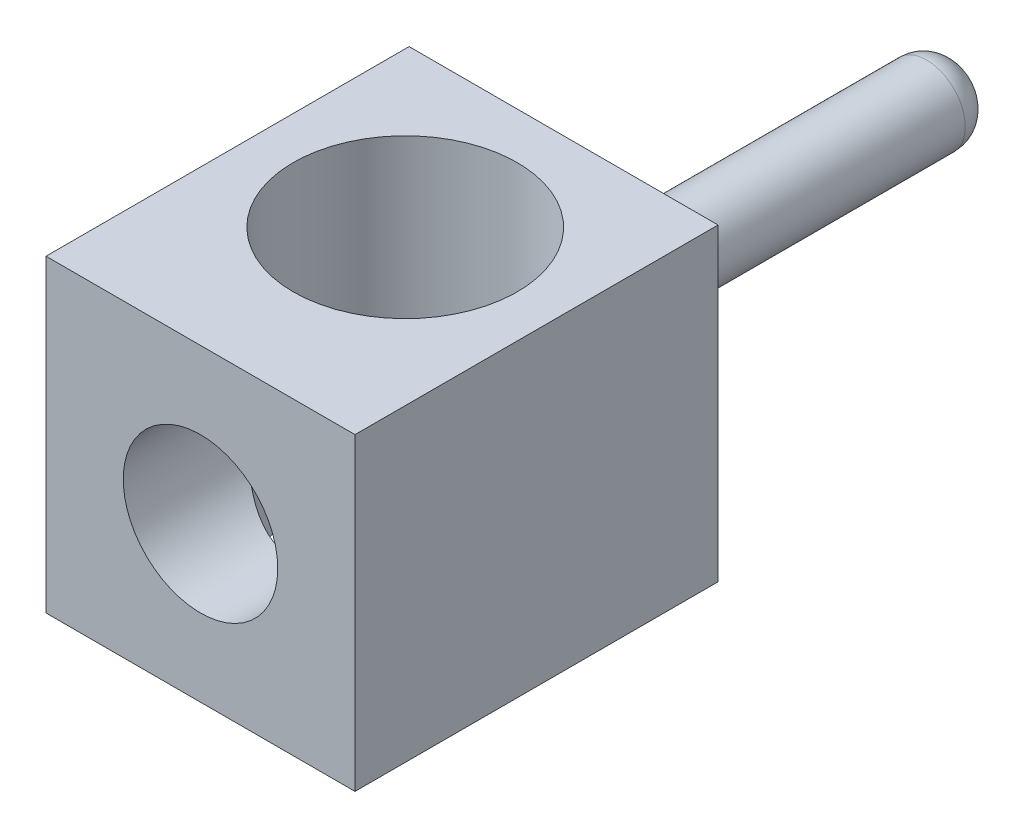
ISO-10303-21;
HEADER;
FILE_DESCRIPTION(('STEP AP214'),'2;1');
FILE_NAME('part.step','',(''),(''),'','','');
FILE_SCHEMA(('AUTOMOTIVE_DESIGN { 1 0 10303 214 1 1 1 1 }'));
ENDSEC;
DATA;
#1=APPLICATION_CONTEXT('core data for automotive mechanical design processes');
#2=APPLICATION_PROTOCOL_DEFINITION('international standard','automotive_design',2000,#1);
#3=PRODUCT_CONTEXT('',#1,'mechanical');
#4=PRODUCT('Part','Part','',(#3));
#5=PRODUCT_RELATED_PRODUCT_CATEGORY('part','',(#4));
#6=PRODUCT_DEFINITION_FORMATION('','',#4);
#7=PRODUCT_DEFINITION_CONTEXT('part definition',#1,'design');
#8=PRODUCT_DEFINITION('design','',#6,#7);
#9=PRODUCT_DEFINITION_SHAPE('','',#8);
#10=(LENGTH_UNIT() NAMED_UNIT(*) SI_UNIT(.MILLI.,.METRE.));
#11=(NAMED_UNIT(*) PLANE_ANGLE_UNIT() SI_UNIT($,.RADIAN.));
#12=(NAMED_UNIT(*) SI_UNIT($,.STERADIAN.) SOLID_ANGLE_UNIT());
#13=UNCERTAINTY_MEASURE_WITH_UNIT(LENGTH_MEASURE(1.E-05),#10,'distance_accuracy_value','');
#14=(GEOMETRIC_REPRESENTATION_CONTEXT(3) GLOBAL_UNCERTAINTY_ASSIGNED_CONTEXT((#13)) GLOBAL_UNIT_ASSIGNED_CONTEXT((#10,
#11,#12)) REPRESENTATION_CONTEXT('',''));
#15=CARTESIAN_POINT('',(0.,0.,0.));
#16=DIRECTION('',(0.,0.,1.));
#17=DIRECTION('',(1.,0.,0.));
#18=AXIS2_PLACEMENT_3D('',#15,#16,#17);
#19=CARTESIAN_POINT('',(0.,0.,-5.1));
#20=DIRECTION('',(0.,0.,-1.));
#21=DIRECTION('',(-1.,0.,0.));
#22=AXIS2_PLACEMENT_3D('',#19,#20,#21);
#23=PLANE('',#22);
#24=CARTESIAN_POINT('',(0.,0.,-5.1));
#25=DIRECTION('',(0.,0.,1.));
#26=DIRECTION('',(-1.,0.,0.));
#27=AXIS2_PLACEMENT_3D('',#24,#25,#26);
#28=CIRCLE('',#27,0.1);
#29=CARTESIAN_POINT('',(-0.1,0.,-5.1));
#30=VERTEX_POINT('',#29);
#31=EDGE_CURVE('E91',#30,#30,#28,.T.);
#32=ORIENTED_EDGE('',*,*,#31,.F.);
#33=EDGE_LOOP('',(#32));
#34=FACE_BOUND('',#33,.T.);
#35=ADVANCED_FACE('F17',(#34),#23,.T.);
#36=CARTESIAN_POINT('',(-0.5,0.,-4.7));
#37=CARTESIAN_POINT('',(-0.5,0.,-4.80471975512));
#38=CARTESIAN_POINT('',(-0.467108925592,0.,-4.909430600282));
#39=CARTESIAN_POINT('',(-0.401276059856,0.,-5.001276059856));
#40=CARTESIAN_POINT('',(-0.309430600282,0.,-5.067108925592));
#41=CARTESIAN_POINT('',(-0.20471975512,0.,-5.1));
#42=CARTESIAN_POINT('',(-0.1,0.,-5.1));
#43=(BOUNDED_CURVE() B_SPLINE_CURVE(6,(#36,#37,#38,#39,#40,#41,#42),.UNSPECIFIED.,.F.,
.F.) B_SPLINE_CURVE_WITH_KNOTS((7,7),(0.,1.570796326795),
.UNSPECIFIED.) CURVE() GEOMETRIC_REPRESENTATION_ITEM() RATIONAL_B_SPLINE_CURVE((1.,1.,1.,1.,1.,
1.,1.)) REPRESENTATION_ITEM(''));
#44=CARTESIAN_POINT('',(0.,0.,-4.7));
#45=DIRECTION('',(0.,0.,1.));
#46=AXIS1_PLACEMENT('',#44,#45);
#47=SURFACE_OF_REVOLUTION('',#43,#46);
#48=CARTESIAN_POINT('',(0.,0.,-4.7));
#49=DIRECTION('',(0.,0.,-1.));
#50=DIRECTION('',(-1.,0.,0.));
#51=AXIS2_PLACEMENT_3D('',#48,#49,#50);
#52=CIRCLE('',#51,0.5);
#53=CARTESIAN_POINT('',(-0.5,0.,-4.7));
#54=VERTEX_POINT('',#53);
#55=EDGE_CURVE('E88',#54,#54,#52,.F.);
#56=ORIENTED_EDGE('',*,*,#55,.F.);
#57=EDGE_LOOP('',(#56));
#58=FACE_BOUND('',#57,.T.);
#59=ORIENTED_EDGE('',*,*,#31,.T.);
#60=EDGE_LOOP('',(#59));
#61=FACE_BOUND('',#60,.T.);
#62=ADVANCED_FACE('F101',(#58,#61),#47,.F.);
#63=CARTESIAN_POINT('',(0.,0.,0.));
#64=DIRECTION('',(0.,0.,-1.));
#65=DIRECTION('',(-1.,0.,0.));
#66=AXIS2_PLACEMENT_3D('',#63,#64,#65);
#67=CYLINDRICAL_SURFACE('',#66,0.5);
#68=ORIENTED_EDGE('',*,*,#55,.T.);
#69=EDGE_LOOP('',(#68));
#70=FACE_BOUND('',#69,.T.);
#71=CARTESIAN_POINT('',(0.,0.,0.));
#72=DIRECTION('',(0.,0.,-1.));
#73=DIRECTION('',(-1.,0.,0.));
#74=AXIS2_PLACEMENT_3D('',#71,#72,#73);
#75=CIRCLE('',#74,0.5);
#76=CARTESIAN_POINT('',(-0.5,0.,0.));
#77=VERTEX_POINT('',#76);
#78=EDGE_CURVE('E21',#77,#77,#75,.F.);
#79=ORIENTED_EDGE('',*,*,#78,.F.);
#80=EDGE_LOOP('',(#79));
#81=FACE_BOUND('',#80,.T.);
#82=ADVANCED_FACE('F105',(#70,#81),#67,.T.);
#83=CARTESIAN_POINT('',(2.,-2.,0.));
#84=DIRECTION('',(0.,0.,-1.));
#85=DIRECTION('',(-1.,0.,0.));
#86=AXIS2_PLACEMENT_3D('',#83,#84,#85);
#87=PLANE('',#86);
#88=ORIENTED_EDGE('',*,*,#78,.T.);
#89=EDGE_LOOP('',(#88));
#90=FACE_BOUND('',#89,.T.);
#91=DIRECTION('',(1.,0.,0.));
#92=VECTOR('',#91,1.);
#93=CARTESIAN_POINT('',(0.,2.,0.));
#94=LINE('',#93,#92);
#95=CARTESIAN_POINT('',(2.,2.,0.));
#96=VERTEX_POINT('',#95);
#97=CARTESIAN_POINT('',(-2.,2.,0.));
#98=VERTEX_POINT('',#97);
#99=EDGE_CURVE('E59',#96,#98,#94,.F.);
#100=ORIENTED_EDGE('',*,*,#99,.F.);
#101=DIRECTION('',(0.,1.,0.));
#102=VECTOR('',#101,1.);
#103=CARTESIAN_POINT('',(2.,-2.,0.));
#104=LINE('',#103,#102);
#105=CARTESIAN_POINT('',(2.,-2.,0.));
#106=VERTEX_POINT('',#105);
#107=EDGE_CURVE('E54',#106,#96,#104,.T.);
#108=ORIENTED_EDGE('',*,*,#107,.F.);
#109=DIRECTION('',(1.,0.,0.));
#110=VECTOR('',#109,1.);
#111=CARTESIAN_POINT('',(0.,-2.,0.));
#112=LINE('',#111,#110);
#113=CARTESIAN_POINT('',(-2.,-2.,0.));
#114=VERTEX_POINT('',#113);
#115=EDGE_CURVE('E73',#106,#114,#112,.F.);
#116=ORIENTED_EDGE('',*,*,#115,.T.);
#117=DIRECTION('',(0.,1.,0.));
#118=VECTOR('',#117,1.);
#119=CARTESIAN_POINT('',(-2.,-2.,0.));
#120=LINE('',#119,#118);
#121=EDGE_CURVE('E71',#98,#114,#120,.F.);
#122=ORIENTED_EDGE('',*,*,#121,.F.);
#123=EDGE_LOOP('',(#100,#108,#116,#122));
#124=FACE_BOUND('',#123,.T.);
#125=ADVANCED_FACE('F72',(#90,#124),#87,.T.);
#126=CARTESIAN_POINT('',(-2.,-2.,0.));
#127=DIRECTION('',(-1.,0.,0.));
#128=DIRECTION('',(0.,0.,1.));
#129=AXIS2_PLACEMENT_3D('',#126,#127,#128);
#130=PLANE('',#129);
#131=DIRECTION('',(0.,0.,1.));
#132=VECTOR('',#131,1.);
#133=CARTESIAN_POINT('',(-2.,2.,0.));
#134=LINE('',#133,#132);
#135=CARTESIAN_POINT('',(-2.,2.,4.7));
#136=VERTEX_POINT('',#135);
#137=EDGE_CURVE('E64',#98,#136,#134,.T.);
#138=ORIENTED_EDGE('',*,*,#137,.F.);
#139=ORIENTED_EDGE('',*,*,#121,.T.);
#140=DIRECTION('',(0.,0.,1.));
#141=VECTOR('',#140,1.);
#142=CARTESIAN_POINT('',(-2.,-2.,0.));
#143=LINE('',#142,#141);
#144=CARTESIAN_POINT('',(-2.,-2.,4.7));
#145=VERTEX_POINT('',#144);
#146=EDGE_CURVE('E154',#114,#145,#143,.T.);
#147=ORIENTED_EDGE('',*,*,#146,.T.);
#148=DIRECTION('',(0.,1.,0.));
#149=VECTOR('',#148,1.);
#150=CARTESIAN_POINT('',(-2.,-2.,4.7));
#151=LINE('',#150,#149);
#152=EDGE_CURVE('E68',#136,#145,#151,.F.);
#153=ORIENTED_EDGE('',*,*,#152,.F.);
#154=EDGE_LOOP('',(#138,#139,#147,#153));
#155=FACE_BOUND('',#154,.T.);
#156=ADVANCED_FACE('F78',(#155),#130,.T.);
#157=CARTESIAN_POINT('',(2.,-2.,4.7));
#158=DIRECTION('',(1.,0.,0.));
#159=DIRECTION('',(0.,0.,-1.));
#160=AXIS2_PLACEMENT_3D('',#157,#158,#159);
#161=PLANE('',#160);
#162=DIRECTION('',(0.,0.,1.));
#163=VECTOR('',#162,1.);
#164=CARTESIAN_POINT('',(2.,2.,0.));
#165=LINE('',#164,#163);
#166=CARTESIAN_POINT('',(2.,2.,4.7));
#167=VERTEX_POINT('',#166);
#168=EDGE_CURVE('E66',#167,#96,#165,.F.);
#169=ORIENTED_EDGE('',*,*,#168,.F.);
#170=DIRECTION('',(0.,1.,0.));
#171=VECTOR('',#170,1.);
#172=CARTESIAN_POINT('',(2.,-2.,4.7));
#173=LINE('',#172,#171);
#174=CARTESIAN_POINT('',(2.,-2.,4.7));
#175=VERTEX_POINT('',#174);
#176=EDGE_CURVE('E36',#175,#167,#173,.T.);
#177=ORIENTED_EDGE('',*,*,#176,.F.);
#178=DIRECTION('',(0.,0.,1.));
#179=VECTOR('',#178,1.);
#180=CARTESIAN_POINT('',(2.,-2.,0.));
#181=LINE('',#180,#179);
#182=EDGE_CURVE('E148',#175,#106,#181,.F.);
#183=ORIENTED_EDGE('',*,*,#182,.T.);
#184=ORIENTED_EDGE('',*,*,#107,.T.);
#185=EDGE_LOOP('',(#169,#177,#183,#184));
#186=FACE_BOUND('',#185,.T.);
#187=ADVANCED_FACE('F162',(#186),#161,.T.);
#188=CARTESIAN_POINT('',(-2.,-2.,4.7));
#189=DIRECTION('',(0.,0.,1.));
#190=DIRECTION('',(1.,0.,0.));
#191=AXIS2_PLACEMENT_3D('',#188,#189,#190);
#192=PLANE('',#191);
#193=CARTESIAN_POINT('',(0.,0.,4.7));
#194=DIRECTION('',(0.,0.,1.));
#195=DIRECTION('',(1.,0.,0.));
#196=AXIS2_PLACEMENT_3D('',#193,#194,#195);
#197=CIRCLE('',#196,1.);
#198=CARTESIAN_POINT('',(1.,0.,4.7));
#199=VERTEX_POINT('',#198);
#200=EDGE_CURVE('E146',#199,#199,#197,.F.);
#201=ORIENTED_EDGE('',*,*,#200,.T.);
#202=EDGE_LOOP('',(#201));
#203=FACE_BOUND('',#202,.T.);
#204=DIRECTION('',(1.,0.,0.));
#205=VECTOR('',#204,1.);
#206=CARTESIAN_POINT('',(0.,2.,4.7));
#207=LINE('',#206,#205);
#208=EDGE_CURVE('E80',#136,#167,#207,.T.);
#209=ORIENTED_EDGE('',*,*,#208,.F.);
#210=ORIENTED_EDGE('',*,*,#152,.T.);
#211=DIRECTION('',(1.,0.,0.));
#212=VECTOR('',#211,1.);
#213=CARTESIAN_POINT('',(0.,-2.,4.7));
#214=LINE('',#213,#212);
#215=EDGE_CURVE('E151',#145,#175,#214,.T.);
#216=ORIENTED_EDGE('',*,*,#215,.T.);
#217=ORIENTED_EDGE('',*,*,#176,.T.);
#218=EDGE_LOOP('',(#209,#210,#216,#217));
#219=FACE_BOUND('',#218,.T.);
#220=ADVANCED_FACE('F161',(#203,#219),#192,.T.);
#221=CARTESIAN_POINT('',(0.,2.,0.));
#222=DIRECTION('',(0.,1.,0.));
#223=DIRECTION('',(0.,0.,1.));
#224=AXIS2_PLACEMENT_3D('',#221,#222,#223);
#225=PLANE('',#224);
#226=CARTESIAN_POINT('',(0.,2.,2.05));
#227=DIRECTION('',(0.,1.,0.));
#228=DIRECTION('',(0.,0.,1.));
#229=AXIS2_PLACEMENT_3D('',#226,#227,#228);
#230=CIRCLE('',#229,1.45);
#231=CARTESIAN_POINT('',(0.,2.,3.5));
#232=VERTEX_POINT('',#231);
#233=EDGE_CURVE('E144',#232,#232,#230,.F.);
#234=ORIENTED_EDGE('',*,*,#233,.T.);
#235=EDGE_LOOP('',(#234));
#236=FACE_BOUND('',#235,.T.);
#237=ORIENTED_EDGE('',*,*,#208,.T.);
#238=ORIENTED_EDGE('',*,*,#168,.T.);
#239=ORIENTED_EDGE('',*,*,#99,.T.);
#240=ORIENTED_EDGE('',*,*,#137,.T.);
#241=EDGE_LOOP('',(#237,#238,#239,#240));
#242=FACE_BOUND('',#241,.T.);
#243=ADVANCED_FACE('F62',(#236,#242),#225,.T.);
#244=CARTESIAN_POINT('',(0.,-2.,0.));
#245=DIRECTION('',(0.,1.,0.));
#246=DIRECTION('',(0.,0.,1.));
#247=AXIS2_PLACEMENT_3D('',#244,#245,#246);
#248=PLANE('',#247);
#249=CARTESIAN_POINT('',(0.,-2.,2.05));
#250=DIRECTION('',(0.,1.,0.));
#251=DIRECTION('',(0.,0.,1.));
#252=AXIS2_PLACEMENT_3D('',#249,#250,#251);
#253=CIRCLE('',#252,1.45);
#254=CARTESIAN_POINT('',(0.,-2.,3.5));
#255=VERTEX_POINT('',#254);
#256=EDGE_CURVE('E27',#255,#255,#253,.T.);
#257=ORIENTED_EDGE('',*,*,#256,.T.);
#258=EDGE_LOOP('',(#257));
#259=FACE_BOUND('',#258,.T.);
#260=ORIENTED_EDGE('',*,*,#215,.F.);
#261=ORIENTED_EDGE('',*,*,#146,.F.);
#262=ORIENTED_EDGE('',*,*,#115,.F.);
#263=ORIENTED_EDGE('',*,*,#182,.F.);
#264=EDGE_LOOP('',(#260,#261,#262,#263));
#265=FACE_BOUND('',#264,.T.);
#266=ADVANCED_FACE('F135',(#259,#265),#248,.F.);
#267=CARTESIAN_POINT('',(0.,0.,-0.4));
#268=DIRECTION('',(0.,0.,1.));
#269=DIRECTION('',(1.,0.,0.));
#270=AXIS2_PLACEMENT_3D('',#267,#268,#269);
#271=CYLINDRICAL_SURFACE('',#270,1.);
#272=CARTESIAN_POINT('',(0.999999999999999,0.,3.1));
#273=CARTESIAN_POINT('',(0.999996725643703,-0.0482517987257578,3.10000612932308));
#274=CARTESIAN_POINT('',(0.996474760820934,-0.0965251108616478,3.10339190011236));
#275=CARTESIAN_POINT('',(0.982705903829006,-0.191301132118056,3.11624105463722));
#276=CARTESIAN_POINT('',(0.972444578053391,-0.237799813865637,3.12571748172209));
#277=CARTESIAN_POINT('',(0.946054268870971,-0.327321715685218,3.148992220261));
#278=CARTESIAN_POINT('',(0.929988427354357,-0.37037646579935,3.16274380974269));
#279=CARTESIAN_POINT('',(0.892620323473742,-0.453090195287985,3.19293731606728));
#280=CARTESIAN_POINT('',(0.871317433854383,-0.49274876712531,3.20937955509759));
#281=CARTESIAN_POINT('',(0.819904615492808,-0.574877118400855,3.24642006225725));
#282=CARTESIAN_POINT('',(0.788915013126587,-0.616691171412374,3.26725133928761));
#283=CARTESIAN_POINT('',(0.720781302894772,-0.695107988750182,3.30879733782764));
#284=CARTESIAN_POINT('',(0.683629979695157,-0.731704548880308,3.32951189290077));
#285=CARTESIAN_POINT('',(0.597101021139564,-0.80445869915771,3.37236792019641));
#286=CARTESIAN_POINT('',(0.546718421297893,-0.839615032882323,3.39420991025368));
#287=CARTESIAN_POINT('',(0.43897401319205,-0.900617853198478,3.43313504284213));
#288=CARTESIAN_POINT('',(0.381625958001846,-0.926482298995059,3.45022735083068));
#289=CARTESIAN_POINT('',(0.277414232609105,-0.961887373521372,3.47394017603697));
#290=CARTESIAN_POINT('',(0.231752083179947,-0.973931066199688,3.48213192643762));
#291=CARTESIAN_POINT('',(0.138632656420834,-0.991473511184489,3.49411826343975));
#292=CARTESIAN_POINT('',(0.0911768169200881,-0.996977395650141,3.49791629797786));
#293=CARTESIAN_POINT('',(-0.00426553383050851,-1.0011333214168,3.5007810711633));
#294=CARTESIAN_POINT('',(-0.0522528518637481,-0.999772909557878,3.4998392107334));
#295=CARTESIAN_POINT('',(-0.147226128554042,-0.990254260383141,3.49329198873787));
#296=CARTESIAN_POINT('',(-0.194211796313016,-0.982094075141453,3.48768529084053));
#297=CARTESIAN_POINT('',(-0.284939066334153,-0.959661650952029,3.47245723160389));
#298=CARTESIAN_POINT('',(-0.328727546561414,-0.945518729231144,3.46292091607748));
#299=CARTESIAN_POINT('',(-0.413226302054718,-0.911765440573545,3.44055986458074));
#300=CARTESIAN_POINT('',(-0.453935982456478,-0.892154020464999,3.42773449521355));
#301=CARTESIAN_POINT('',(-0.53609409708104,-0.845622133972976,3.3980428355744));
#302=CARTESIAN_POINT('',(-0.577109879485149,-0.818127424845007,3.38088419018411));
#303=CARTESIAN_POINT('',(-0.654213150738966,-0.757894022770773,3.34472880551493));
#304=CARTESIAN_POINT('',(-0.690295046214468,-0.725149468099604,3.32573002112431));
#305=CARTESIAN_POINT('',(-0.763046597192127,-0.64884841951758,3.28382018458661));
#306=CARTESIAN_POINT('',(-0.798725546995236,-0.604402049692863,3.2608037314741));
#307=CARTESIAN_POINT('',(-0.862338583599141,-0.509539580694057,3.21635128152692));
#308=CARTESIAN_POINT('',(-0.890275785672797,-0.459125894451945,3.19491465152919));
#309=CARTESIAN_POINT('',(-0.931960528926906,-0.365278720964839,3.16107818410096));
#310=CARTESIAN_POINT('',(-0.947499585693052,-0.322985489342329,3.1477383220689));
#311=CARTESIAN_POINT('',(-0.972890597635681,-0.235675022224081,3.12530137829489));
#312=CARTESIAN_POINT('',(-0.982753128184936,-0.190663025864341,3.11619641305196));
#313=CARTESIAN_POINT('',(-0.996237860705248,-0.0984645416749238,3.10361366770527));
#314=CARTESIAN_POINT('',(-0.999802128199774,-0.0512619237132144,3.10018814743777));
#315=CARTESIAN_POINT('',(-1.00018160072332,0.0431944281756996,3.09982734865734));
#316=CARTESIAN_POINT('',(-0.996997898169166,0.0904481525915763,3.10289101962075));
#317=CARTESIAN_POINT('',(-0.984994275463163,0.177394794765406,3.11411396640184));
#318=CARTESIAN_POINT('',(-0.976934196236486,0.217290758562538,3.12158334725145));
#319=CARTESIAN_POINT('',(-0.956324752607989,0.295066383264978,3.14001556126637));
#320=CARTESIAN_POINT('',(-0.943770974186974,0.332944019453802,3.15098182815233));
#321=CARTESIAN_POINT('',(-0.907851093746579,0.423251092557616,3.18096117236591));
#322=CARTESIAN_POINT('',(-0.882169834331486,0.474303100400254,3.20134959591115));
#323=CARTESIAN_POINT('',(-0.823082094428914,0.570740386392268,3.24430934619138));
#324=CARTESIAN_POINT('',(-0.789660861423204,0.616114584871877,3.26688479301509));
#325=CARTESIAN_POINT('',(-0.715042357796971,0.701409222610373,3.31220148620673));
#326=CARTESIAN_POINT('',(-0.673726782568368,0.741228258873084,3.33493939984662));
#327=CARTESIAN_POINT('',(-0.584175237836735,0.813661618934084,3.3780440535197));
#328=CARTESIAN_POINT('',(-0.535950004838519,0.846286924575522,3.39841438506813));
#329=CARTESIAN_POINT('',(-0.441980941567908,0.898347691706031,3.4317385953815));
#330=CARTESIAN_POINT('',(-0.397196798201003,0.919080688293006,3.44536412200676));
#331=CARTESIAN_POINT('',(-0.304122229130354,0.95392535219687,3.46855691968489));
#332=CARTESIAN_POINT('',(-0.255834022761709,0.968041169027562,3.47812673363962));
#333=CARTESIAN_POINT('',(-0.156702255617867,0.988949854787801,3.49238086274647));
#334=CARTESIAN_POINT('',(-0.105846598846535,0.995703847845251,3.49703923768081));
#335=CARTESIAN_POINT('',(-0.00349703989023075,1.00130490783963,3.50089864479629));
#336=CARTESIAN_POINT('',(0.0479966665191863,1.00015434299577,3.50010131151735));
#337=CARTESIAN_POINT('',(0.145282797595631,0.990489501622737,3.49345403745471));
#338=CARTESIAN_POINT('',(0.191175399036832,0.982638297589703,3.4880591256766));
#339=CARTESIAN_POINT('',(0.280816180484097,0.960869857616101,3.47327342217792));
#340=CARTESIAN_POINT('',(0.324563927895468,0.946951403527973,3.46388182803544));
#341=CARTESIAN_POINT('',(0.410834519907647,0.91293920373988,3.44132632330768));
#342=CARTESIAN_POINT('',(0.453223899420398,0.892605750890831,3.42801762484737));
#343=CARTESIAN_POINT('',(0.534055714115979,0.846727157387102,3.39875316978896));
#344=CARTESIAN_POINT('',(0.57249729337002,0.821180890105015,3.38279684110729));
#345=CARTESIAN_POINT('',(0.650785726966258,0.761105688034018,3.34657906594809));
#346=CARTESIAN_POINT('',(0.689902319812065,0.72579586595156,3.32603524588167));
#347=CARTESIAN_POINT('',(0.762063566126967,0.64962955363811,3.28430239761791));
#348=CARTESIAN_POINT('',(0.795094617202545,0.608760984323835,3.26311204452715));
#349=CARTESIAN_POINT('',(0.858935227231603,0.515625598011027,3.21894817929581));
#350=CARTESIAN_POINT('',(0.888729544549018,0.462565245292855,3.19616113640831));
#351=CARTESIAN_POINT('',(0.938613942530697,0.35034065498733,3.15568604374131));
#352=CARTESIAN_POINT('',(0.95874064511557,0.291200499250315,3.13797885533787));
#353=CARTESIAN_POINT('',(0.982009840246289,0.192647858052324,3.1169101272786));
#354=CARTESIAN_POINT('',(0.988721694311641,0.154692250556813,3.11064454216192));
#355=CARTESIAN_POINT('',(0.997715855623998,0.0778284255936063,3.10218906672028));
#356=CARTESIAN_POINT('',(1.00000264118474,0.0389212116188098,3.0999950559215));
#357=CARTESIAN_POINT('',(0.999999999999999,0.,3.1));
#358=B_SPLINE_CURVE_WITH_KNOTS('',3,(#272,#273,#274,#275,#276,#277,#278,#279,#280,#281,#282,
#283,#284,#285,#286,#287,#288,#289,#290,#291,#292,#293,#294,#295,#296,#297,#298,#299,#300,#301,
#302,#303,#304,#305,#306,#307,#308,#309,#310,#311,#312,#313,#314,#315,#316,#317,#318,#319,#320,
#321,#322,#323,#324,#325,#326,#327,#328,#329,#330,#331,#332,#333,#334,#335,#336,#337,#338,#339,
#340,#341,#342,#343,#344,#345,#346,#347,#348,#349,#350,#351,#352,#353,#354,#355,#356,#357),
.UNSPECIFIED.,.T.,.F.,(4,2,2,2,2,2,2,2,2,2,2,2,2,2,2,2,2,2,2,2,2,2,2,2,2,2,2,2,2,2,2,2,2,2,2,2,
2,2,2,2,2,2,4),(0.,0.144571043253029,0.289452726644265,0.432803622514584,0.57617169628003,
0.743743677348844,0.911513287749978,1.10604512960516,1.30019893467817,1.44336726334475,
1.58642316532782,1.72973869157191,1.87309528742484,2.0134999365063,2.15393164465633,
2.3101707513573,2.46658553784378,2.65022382079082,2.83378810018362,2.97425316484043,
3.11445568880446,3.25594127885415,3.39740396580346,3.5210614036015,3.64484064102872,
3.82590023078954,4.00730780549778,4.19168412604456,4.37577700115984,4.52873576784842,
4.68159848812536,4.83526458326921,4.98888464179335,5.12886116485338,5.26886580454774,
5.41488796746917,5.56094172314171,5.72997164923816,5.89937492462638,6.09332225174408,
6.28652897621345,6.40326210664389,6.51987703742365),.UNSPECIFIED.);
#359=CARTESIAN_POINT('',(0.999999999999999,0.,3.1));
#360=VERTEX_POINT('',#359);
#361=EDGE_CURVE('E11',#360,#360,#358,.T.);
#362=ORIENTED_EDGE('',*,*,#361,.T.);
#363=EDGE_LOOP('',(#362));
#364=FACE_BOUND('',#363,.T.);
#365=ORIENTED_EDGE('',*,*,#200,.F.);
#366=EDGE_LOOP('',(#365));
#367=FACE_BOUND('',#366,.T.);
#368=ADVANCED_FACE('F124',(#364,#367),#271,.F.);
#369=CARTESIAN_POINT('',(0.,-2.,2.05));
#370=DIRECTION('',(0.,1.,0.));
#371=DIRECTION('',(0.,0.,1.));
#372=AXIS2_PLACEMENT_3D('',#369,#370,#371);
#373=CYLINDRICAL_SURFACE('',#372,1.45);
#374=ORIENTED_EDGE('',*,*,#256,.F.);
#375=EDGE_LOOP('',(#374));
#376=FACE_BOUND('',#375,.T.);
#377=ORIENTED_EDGE('',*,*,#361,.F.);
#378=EDGE_LOOP('',(#377));
#379=FACE_BOUND('',#378,.T.);
#380=ORIENTED_EDGE('',*,*,#233,.F.);
#381=EDGE_LOOP('',(#380));
#382=FACE_BOUND('',#381,.T.);
#383=ADVANCED_FACE('F127',(#376,#379,#382),#373,.F.);
#384=CLOSED_SHELL('',(#35,#62,#82,#125,#156,#187,#220,#243,#266,#368,#383));
#385=MANIFOLD_SOLID_BREP('B1',#384);
#386=ADVANCED_BREP_SHAPE_REPRESENTATION('',(#18,#385),#14);
#387=SHAPE_DEFINITION_REPRESENTATION(#9,#386);
ENDSEC;
END-ISO-10303-21;
